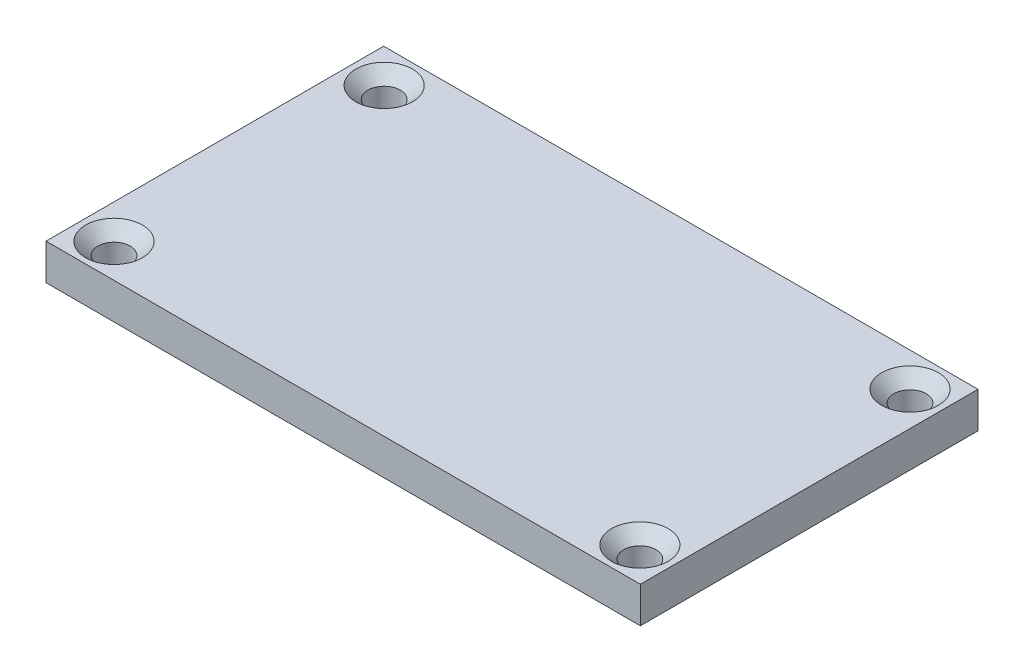
ISO-10303-21;
HEADER;
FILE_DESCRIPTION(('STEP AP214'),'2;1');
FILE_NAME('part.step','',(''),(''),'','','');
FILE_SCHEMA(('AUTOMOTIVE_DESIGN { 1 0 10303 214 1 1 1 1 }'));
ENDSEC;
DATA;
#1=APPLICATION_CONTEXT('core data for automotive mechanical design processes');
#2=APPLICATION_PROTOCOL_DEFINITION('international standard','automotive_design',2000,#1);
#3=PRODUCT_CONTEXT('',#1,'mechanical');
#4=PRODUCT('Part','Part','',(#3));
#5=PRODUCT_RELATED_PRODUCT_CATEGORY('part','',(#4));
#6=PRODUCT_DEFINITION_FORMATION('','',#4);
#7=PRODUCT_DEFINITION_CONTEXT('part definition',#1,'design');
#8=PRODUCT_DEFINITION('design','',#6,#7);
#9=PRODUCT_DEFINITION_SHAPE('','',#8);
#10=(LENGTH_UNIT() NAMED_UNIT(*) SI_UNIT(.MILLI.,.METRE.));
#11=(NAMED_UNIT(*) PLANE_ANGLE_UNIT() SI_UNIT($,.RADIAN.));
#12=(NAMED_UNIT(*) SI_UNIT($,.STERADIAN.) SOLID_ANGLE_UNIT());
#13=UNCERTAINTY_MEASURE_WITH_UNIT(LENGTH_MEASURE(1.E-05),#10,'distance_accuracy_value','');
#14=(GEOMETRIC_REPRESENTATION_CONTEXT(3) GLOBAL_UNCERTAINTY_ASSIGNED_CONTEXT((#13)) GLOBAL_UNIT_ASSIGNED_CONTEXT((#10,
#11,#12)) REPRESENTATION_CONTEXT('',''));
#15=CARTESIAN_POINT('',(0.,0.,0.));
#16=DIRECTION('',(0.,0.,1.));
#17=DIRECTION('',(1.,0.,0.));
#18=AXIS2_PLACEMENT_3D('',#15,#16,#17);
#19=CARTESIAN_POINT('',(33.,2.,18.75));
#20=DIRECTION('',(-1.,0.,0.));
#21=DIRECTION('',(0.,0.,1.));
#22=AXIS2_PLACEMENT_3D('',#19,#20,#21);
#23=PLANE('',#22);
#24=DIRECTION('',(0.,0.,-1.));
#25=VECTOR('',#24,1.);
#26=CARTESIAN_POINT('',(33.,-2.,18.75));
#27=LINE('',#26,#25);
#28=CARTESIAN_POINT('',(33.,-2.,18.75));
#29=VERTEX_POINT('',#28);
#30=CARTESIAN_POINT('',(33.,-2.,-18.75));
#31=VERTEX_POINT('',#30);
#32=EDGE_CURVE('E104',#29,#31,#27,.T.);
#33=ORIENTED_EDGE('',*,*,#32,.T.);
#34=DIRECTION('',(0.,-1.,0.));
#35=VECTOR('',#34,1.);
#36=CARTESIAN_POINT('',(33.,2.,-18.75));
#37=LINE('',#36,#35);
#38=CARTESIAN_POINT('',(33.,2.,-18.75));
#39=VERTEX_POINT('',#38);
#40=EDGE_CURVE('E11',#39,#31,#37,.T.);
#41=ORIENTED_EDGE('',*,*,#40,.F.);
#42=DIRECTION('',(0.,0.,-1.));
#43=VECTOR('',#42,1.);
#44=CARTESIAN_POINT('',(33.,2.,18.75));
#45=LINE('',#44,#43);
#46=CARTESIAN_POINT('',(33.,2.,18.75));
#47=VERTEX_POINT('',#46);
#48=EDGE_CURVE('E91',#47,#39,#45,.T.);
#49=ORIENTED_EDGE('',*,*,#48,.F.);
#50=DIRECTION('',(0.,-1.,0.));
#51=VECTOR('',#50,1.);
#52=CARTESIAN_POINT('',(33.,2.,18.75));
#53=LINE('',#52,#51);
#54=EDGE_CURVE('E100',#47,#29,#53,.T.);
#55=ORIENTED_EDGE('',*,*,#54,.T.);
#56=EDGE_LOOP('',(#33,#41,#49,#55));
#57=FACE_BOUND('',#56,.T.);
#58=ADVANCED_FACE('F38',(#57),#23,.F.);
#59=CARTESIAN_POINT('',(-33.,2.,-18.75));
#60=DIRECTION('',(0.,0.,1.));
#61=DIRECTION('',(1.,0.,0.));
#62=AXIS2_PLACEMENT_3D('',#59,#60,#61);
#63=PLANE('',#62);
#64=DIRECTION('',(-1.,0.,0.));
#65=VECTOR('',#64,1.);
#66=CARTESIAN_POINT('',(-33.,-2.,-18.75));
#67=LINE('',#66,#65);
#68=CARTESIAN_POINT('',(-33.,-2.,-18.75));
#69=VERTEX_POINT('',#68);
#70=EDGE_CURVE('E95',#31,#69,#67,.T.);
#71=ORIENTED_EDGE('',*,*,#70,.T.);
#72=DIRECTION('',(0.,-1.,0.));
#73=VECTOR('',#72,1.);
#74=CARTESIAN_POINT('',(-33.,2.,-18.75));
#75=LINE('',#74,#73);
#76=CARTESIAN_POINT('',(-33.,2.,-18.75));
#77=VERTEX_POINT('',#76);
#78=EDGE_CURVE('E47',#77,#69,#75,.T.);
#79=ORIENTED_EDGE('',*,*,#78,.F.);
#80=DIRECTION('',(-1.,0.,0.));
#81=VECTOR('',#80,1.);
#82=CARTESIAN_POINT('',(-33.,2.,-18.75));
#83=LINE('',#82,#81);
#84=EDGE_CURVE('E86',#39,#77,#83,.T.);
#85=ORIENTED_EDGE('',*,*,#84,.F.);
#86=ORIENTED_EDGE('',*,*,#40,.T.);
#87=EDGE_LOOP('',(#71,#79,#85,#86));
#88=FACE_BOUND('',#87,.T.);
#89=ADVANCED_FACE('F94',(#88),#63,.F.);
#90=CARTESIAN_POINT('',(-33.,2.,18.75));
#91=DIRECTION('',(1.,0.,0.));
#92=DIRECTION('',(0.,0.,-1.));
#93=AXIS2_PLACEMENT_3D('',#90,#91,#92);
#94=PLANE('',#93);
#95=DIRECTION('',(0.,0.,1.));
#96=VECTOR('',#95,1.);
#97=CARTESIAN_POINT('',(-33.,-2.,18.75));
#98=LINE('',#97,#96);
#99=CARTESIAN_POINT('',(-33.,-2.,18.75));
#100=VERTEX_POINT('',#99);
#101=EDGE_CURVE('E73',#69,#100,#98,.T.);
#102=ORIENTED_EDGE('',*,*,#101,.T.);
#103=DIRECTION('',(0.,-1.,0.));
#104=VECTOR('',#103,1.);
#105=CARTESIAN_POINT('',(-33.,2.,18.75));
#106=LINE('',#105,#104);
#107=CARTESIAN_POINT('',(-33.,2.,18.75));
#108=VERTEX_POINT('',#107);
#109=EDGE_CURVE('E96',#108,#100,#106,.T.);
#110=ORIENTED_EDGE('',*,*,#109,.F.);
#111=DIRECTION('',(0.,0.,1.));
#112=VECTOR('',#111,1.);
#113=CARTESIAN_POINT('',(-33.,2.,18.75));
#114=LINE('',#113,#112);
#115=EDGE_CURVE('E89',#77,#108,#114,.T.);
#116=ORIENTED_EDGE('',*,*,#115,.F.);
#117=ORIENTED_EDGE('',*,*,#78,.T.);
#118=EDGE_LOOP('',(#102,#110,#116,#117));
#119=FACE_BOUND('',#118,.T.);
#120=ADVANCED_FACE('F98',(#119),#94,.F.);
#121=CARTESIAN_POINT('',(-33.,2.,18.75));
#122=DIRECTION('',(0.,0.,-1.));
#123=DIRECTION('',(-1.,0.,0.));
#124=AXIS2_PLACEMENT_3D('',#121,#122,#123);
#125=PLANE('',#124);
#126=DIRECTION('',(1.,0.,0.));
#127=VECTOR('',#126,1.);
#128=CARTESIAN_POINT('',(-33.,-2.,18.75));
#129=LINE('',#128,#127);
#130=EDGE_CURVE('E79',#100,#29,#129,.T.);
#131=ORIENTED_EDGE('',*,*,#130,.T.);
#132=ORIENTED_EDGE('',*,*,#54,.F.);
#133=DIRECTION('',(1.,0.,0.));
#134=VECTOR('',#133,1.);
#135=CARTESIAN_POINT('',(-33.,2.,18.75));
#136=LINE('',#135,#134);
#137=EDGE_CURVE('E56',#108,#47,#136,.T.);
#138=ORIENTED_EDGE('',*,*,#137,.F.);
#139=ORIENTED_EDGE('',*,*,#109,.T.);
#140=EDGE_LOOP('',(#131,#132,#138,#139));
#141=FACE_BOUND('',#140,.T.);
#142=ADVANCED_FACE('F155',(#141),#125,.F.);
#143=CARTESIAN_POINT('',(0.,2.,0.));
#144=DIRECTION('',(0.,-1.,0.));
#145=DIRECTION('',(0.,0.,-1.));
#146=AXIS2_PLACEMENT_3D('',#143,#144,#145);
#147=PLANE('',#146);
#148=CARTESIAN_POINT('',(-29.2,2.,15.));
#149=DIRECTION('',(0.,1.,0.));
#150=DIRECTION('',(0.,0.,1.));
#151=AXIS2_PLACEMENT_3D('',#148,#149,#150);
#152=CIRCLE('',#151,3.15);
#153=CARTESIAN_POINT('',(-29.2,2.,18.15));
#154=VERTEX_POINT('',#153);
#155=EDGE_CURVE('E314',#154,#154,#152,.T.);
#156=ORIENTED_EDGE('',*,*,#155,.F.);
#157=EDGE_LOOP('',(#156));
#158=FACE_BOUND('',#157,.T.);
#159=CARTESIAN_POINT('',(-29.2,2.,-15.));
#160=DIRECTION('',(0.,1.,0.));
#161=DIRECTION('',(0.,0.,1.));
#162=AXIS2_PLACEMENT_3D('',#159,#160,#161);
#163=CIRCLE('',#162,3.15);
#164=CARTESIAN_POINT('',(-29.2,2.,-11.85));
#165=VERTEX_POINT('',#164);
#166=EDGE_CURVE('E129',#165,#165,#163,.T.);
#167=ORIENTED_EDGE('',*,*,#166,.F.);
#168=EDGE_LOOP('',(#167));
#169=FACE_BOUND('',#168,.T.);
#170=CARTESIAN_POINT('',(29.2,2.,-15.));
#171=DIRECTION('',(0.,1.,0.));
#172=DIRECTION('',(0.,0.,1.));
#173=AXIS2_PLACEMENT_3D('',#170,#171,#172);
#174=CIRCLE('',#173,3.15);
#175=CARTESIAN_POINT('',(29.2,2.,-11.85));
#176=VERTEX_POINT('',#175);
#177=EDGE_CURVE('E122',#176,#176,#174,.T.);
#178=ORIENTED_EDGE('',*,*,#177,.F.);
#179=EDGE_LOOP('',(#178));
#180=FACE_BOUND('',#179,.T.);
#181=CARTESIAN_POINT('',(29.2,2.,15.));
#182=DIRECTION('',(0.,1.,0.));
#183=DIRECTION('',(0.,0.,1.));
#184=AXIS2_PLACEMENT_3D('',#181,#182,#183);
#185=CIRCLE('',#184,3.15);
#186=CARTESIAN_POINT('',(29.2,2.,18.15));
#187=VERTEX_POINT('',#186);
#188=EDGE_CURVE('E118',#187,#187,#185,.T.);
#189=ORIENTED_EDGE('',*,*,#188,.F.);
#190=EDGE_LOOP('',(#189));
#191=FACE_BOUND('',#190,.T.);
#192=ORIENTED_EDGE('',*,*,#48,.T.);
#193=ORIENTED_EDGE('',*,*,#84,.T.);
#194=ORIENTED_EDGE('',*,*,#115,.T.);
#195=ORIENTED_EDGE('',*,*,#137,.T.);
#196=EDGE_LOOP('',(#192,#193,#194,#195));
#197=FACE_BOUND('',#196,.T.);
#198=ADVANCED_FACE('F87',(#158,#169,#180,#191,#197),#147,.F.);
#199=CARTESIAN_POINT('',(0.,-2.,0.));
#200=DIRECTION('',(0.,-1.,0.));
#201=DIRECTION('',(0.,0.,-1.));
#202=AXIS2_PLACEMENT_3D('',#199,#200,#201);
#203=PLANE('',#202);
#204=CARTESIAN_POINT('',(-29.2,-2.,15.));
#205=DIRECTION('',(0.,-1.,0.));
#206=DIRECTION('',(0.,0.,-1.));
#207=AXIS2_PLACEMENT_3D('',#204,#205,#206);
#208=CIRCLE('',#207,1.79999999999999);
#209=CARTESIAN_POINT('',(-29.2,-2.,13.2));
#210=VERTEX_POINT('',#209);
#211=EDGE_CURVE('E41',#210,#210,#208,.T.);
#212=ORIENTED_EDGE('',*,*,#211,.F.);
#213=EDGE_LOOP('',(#212));
#214=FACE_BOUND('',#213,.T.);
#215=CARTESIAN_POINT('',(-29.2,-2.,-15.));
#216=DIRECTION('',(0.,-1.,0.));
#217=DIRECTION('',(0.,0.,-1.));
#218=AXIS2_PLACEMENT_3D('',#215,#216,#217);
#219=CIRCLE('',#218,1.79999999999999);
#220=CARTESIAN_POINT('',(-29.2,-2.,-16.8));
#221=VERTEX_POINT('',#220);
#222=EDGE_CURVE('E120',#221,#221,#219,.T.);
#223=ORIENTED_EDGE('',*,*,#222,.F.);
#224=EDGE_LOOP('',(#223));
#225=FACE_BOUND('',#224,.T.);
#226=CARTESIAN_POINT('',(29.2,-2.,-15.));
#227=DIRECTION('',(0.,-1.,0.));
#228=DIRECTION('',(0.,0.,-1.));
#229=AXIS2_PLACEMENT_3D('',#226,#227,#228);
#230=CIRCLE('',#229,1.79999999999999);
#231=CARTESIAN_POINT('',(29.2,-2.,-16.8));
#232=VERTEX_POINT('',#231);
#233=EDGE_CURVE('E116',#232,#232,#230,.T.);
#234=ORIENTED_EDGE('',*,*,#233,.F.);
#235=EDGE_LOOP('',(#234));
#236=FACE_BOUND('',#235,.T.);
#237=CARTESIAN_POINT('',(29.2,-2.,15.));
#238=DIRECTION('',(0.,-1.,0.));
#239=DIRECTION('',(0.,0.,-1.));
#240=AXIS2_PLACEMENT_3D('',#237,#238,#239);
#241=CIRCLE('',#240,1.79999999999999);
#242=CARTESIAN_POINT('',(29.2,-2.,13.2));
#243=VERTEX_POINT('',#242);
#244=EDGE_CURVE('E107',#243,#243,#241,.T.);
#245=ORIENTED_EDGE('',*,*,#244,.F.);
#246=EDGE_LOOP('',(#245));
#247=FACE_BOUND('',#246,.T.);
#248=ORIENTED_EDGE('',*,*,#32,.F.);
#249=ORIENTED_EDGE('',*,*,#130,.F.);
#250=ORIENTED_EDGE('',*,*,#101,.F.);
#251=ORIENTED_EDGE('',*,*,#70,.F.);
#252=EDGE_LOOP('',(#248,#249,#250,#251));
#253=FACE_BOUND('',#252,.T.);
#254=ADVANCED_FACE('F154',(#214,#225,#236,#247,#253),#203,.T.);
#255=CARTESIAN_POINT('',(29.2,2.,15.));
#256=DIRECTION('',(0.,1.,0.));
#257=DIRECTION('',(0.,0.,1.));
#258=AXIS2_PLACEMENT_3D('',#255,#256,#257);
#259=CYLINDRICAL_SURFACE('',#258,1.79999999999999);
#260=ORIENTED_EDGE('',*,*,#244,.T.);
#261=EDGE_LOOP('',(#260));
#262=FACE_BOUND('',#261,.T.);
#263=CARTESIAN_POINT('',(29.2,0.649999999999999,15.));
#264=DIRECTION('',(0.,1.,0.));
#265=DIRECTION('',(0.,0.,1.));
#266=AXIS2_PLACEMENT_3D('',#263,#264,#265);
#267=CIRCLE('',#266,1.8);
#268=CARTESIAN_POINT('',(29.2,0.649999999999999,16.8));
#269=VERTEX_POINT('',#268);
#270=EDGE_CURVE('E115',#269,#269,#267,.T.);
#271=ORIENTED_EDGE('',*,*,#270,.T.);
#272=EDGE_LOOP('',(#271));
#273=FACE_BOUND('',#272,.T.);
#274=ADVANCED_FACE('F144',(#262,#273),#259,.F.);
#275=CARTESIAN_POINT('',(29.2,2.,15.));
#276=DIRECTION('',(0.,1.,0.));
#277=DIRECTION('',(0.,0.,1.));
#278=AXIS2_PLACEMENT_3D('',#275,#276,#277);
#279=CONICAL_SURFACE('',#278,3.15,0.785398163397447);
#280=ORIENTED_EDGE('',*,*,#270,.F.);
#281=EDGE_LOOP('',(#280));
#282=FACE_BOUND('',#281,.T.);
#283=ORIENTED_EDGE('',*,*,#188,.T.);
#284=EDGE_LOOP('',(#283));
#285=FACE_BOUND('',#284,.T.);
#286=ADVANCED_FACE('F146',(#282,#285),#279,.F.);
#287=CARTESIAN_POINT('',(29.2,2.,-15.));
#288=DIRECTION('',(0.,1.,0.));
#289=DIRECTION('',(0.,0.,1.));
#290=AXIS2_PLACEMENT_3D('',#287,#288,#289);
#291=CYLINDRICAL_SURFACE('',#290,1.79999999999999);
#292=ORIENTED_EDGE('',*,*,#233,.T.);
#293=EDGE_LOOP('',(#292));
#294=FACE_BOUND('',#293,.T.);
#295=CARTESIAN_POINT('',(29.2,0.649999999999999,-15.));
#296=DIRECTION('',(0.,1.,0.));
#297=DIRECTION('',(0.,0.,1.));
#298=AXIS2_PLACEMENT_3D('',#295,#296,#297);
#299=CIRCLE('',#298,1.8);
#300=CARTESIAN_POINT('',(29.2,0.649999999999999,-13.2));
#301=VERTEX_POINT('',#300);
#302=EDGE_CURVE('E119',#301,#301,#299,.T.);
#303=ORIENTED_EDGE('',*,*,#302,.T.);
#304=EDGE_LOOP('',(#303));
#305=FACE_BOUND('',#304,.T.);
#306=ADVANCED_FACE('F149',(#294,#305),#291,.F.);
#307=CARTESIAN_POINT('',(29.2,2.,-15.));
#308=DIRECTION('',(0.,1.,0.));
#309=DIRECTION('',(0.,0.,1.));
#310=AXIS2_PLACEMENT_3D('',#307,#308,#309);
#311=CONICAL_SURFACE('',#310,3.15,0.785398163397449);
#312=ORIENTED_EDGE('',*,*,#302,.F.);
#313=EDGE_LOOP('',(#312));
#314=FACE_BOUND('',#313,.T.);
#315=ORIENTED_EDGE('',*,*,#177,.T.);
#316=EDGE_LOOP('',(#315));
#317=FACE_BOUND('',#316,.T.);
#318=ADVANCED_FACE('F223',(#314,#317),#311,.F.);
#319=CARTESIAN_POINT('',(-29.2,2.,-15.));
#320=DIRECTION('',(0.,1.,0.));
#321=DIRECTION('',(0.,0.,1.));
#322=AXIS2_PLACEMENT_3D('',#319,#320,#321);
#323=CYLINDRICAL_SURFACE('',#322,1.79999999999999);
#324=ORIENTED_EDGE('',*,*,#222,.T.);
#325=EDGE_LOOP('',(#324));
#326=FACE_BOUND('',#325,.T.);
#327=CARTESIAN_POINT('',(-29.2,0.649999999999999,-15.));
#328=DIRECTION('',(0.,1.,0.));
#329=DIRECTION('',(0.,0.,1.));
#330=AXIS2_PLACEMENT_3D('',#327,#328,#329);
#331=CIRCLE('',#330,1.8);
#332=CARTESIAN_POINT('',(-29.2,0.649999999999999,-13.2));
#333=VERTEX_POINT('',#332);
#334=EDGE_CURVE('E123',#333,#333,#331,.T.);
#335=ORIENTED_EDGE('',*,*,#334,.T.);
#336=EDGE_LOOP('',(#335));
#337=FACE_BOUND('',#336,.T.);
#338=ADVANCED_FACE('F234',(#326,#337),#323,.F.);
#339=CARTESIAN_POINT('',(-29.2,2.,-15.));
#340=DIRECTION('',(0.,1.,0.));
#341=DIRECTION('',(0.,0.,1.));
#342=AXIS2_PLACEMENT_3D('',#339,#340,#341);
#343=CONICAL_SURFACE('',#342,3.15,0.785398163397447);
#344=ORIENTED_EDGE('',*,*,#334,.F.);
#345=EDGE_LOOP('',(#344));
#346=FACE_BOUND('',#345,.T.);
#347=ORIENTED_EDGE('',*,*,#166,.T.);
#348=EDGE_LOOP('',(#347));
#349=FACE_BOUND('',#348,.T.);
#350=ADVANCED_FACE('F245',(#346,#349),#343,.F.);
#351=CARTESIAN_POINT('',(-29.2,2.,15.));
#352=DIRECTION('',(0.,1.,0.));
#353=DIRECTION('',(0.,0.,1.));
#354=AXIS2_PLACEMENT_3D('',#351,#352,#353);
#355=CYLINDRICAL_SURFACE('',#354,1.79999999999999);
#356=ORIENTED_EDGE('',*,*,#211,.T.);
#357=EDGE_LOOP('',(#356));
#358=FACE_BOUND('',#357,.T.);
#359=CARTESIAN_POINT('',(-29.2,0.649999999999999,15.));
#360=DIRECTION('',(0.,1.,0.));
#361=DIRECTION('',(0.,0.,1.));
#362=AXIS2_PLACEMENT_3D('',#359,#360,#361);
#363=CIRCLE('',#362,1.8);
#364=CARTESIAN_POINT('',(-29.2,0.649999999999999,16.8));
#365=VERTEX_POINT('',#364);
#366=EDGE_CURVE('E312',#365,#365,#363,.T.);
#367=ORIENTED_EDGE('',*,*,#366,.T.);
#368=EDGE_LOOP('',(#367));
#369=FACE_BOUND('',#368,.T.);
#370=ADVANCED_FACE('F255',(#358,#369),#355,.F.);
#371=CARTESIAN_POINT('',(-29.2,2.,15.));
#372=DIRECTION('',(0.,1.,0.));
#373=DIRECTION('',(0.,0.,1.));
#374=AXIS2_PLACEMENT_3D('',#371,#372,#373);
#375=CONICAL_SURFACE('',#374,3.15,0.785398163397447);
#376=ORIENTED_EDGE('',*,*,#366,.F.);
#377=EDGE_LOOP('',(#376));
#378=FACE_BOUND('',#377,.T.);
#379=ORIENTED_EDGE('',*,*,#155,.T.);
#380=EDGE_LOOP('',(#379));
#381=FACE_BOUND('',#380,.T.);
#382=ADVANCED_FACE('F266',(#378,#381),#375,.F.);
#383=CLOSED_SHELL('',(#58,#89,#120,#142,#198,#254,#274,#286,#306,#318,#338,#350,#370,#382));
#384=MANIFOLD_SOLID_BREP('B2',#383);
#385=ADVANCED_BREP_SHAPE_REPRESENTATION('',(#18,#384),#14);
#386=SHAPE_DEFINITION_REPRESENTATION(#9,#385);
ENDSEC;
END-ISO-10303-21;
